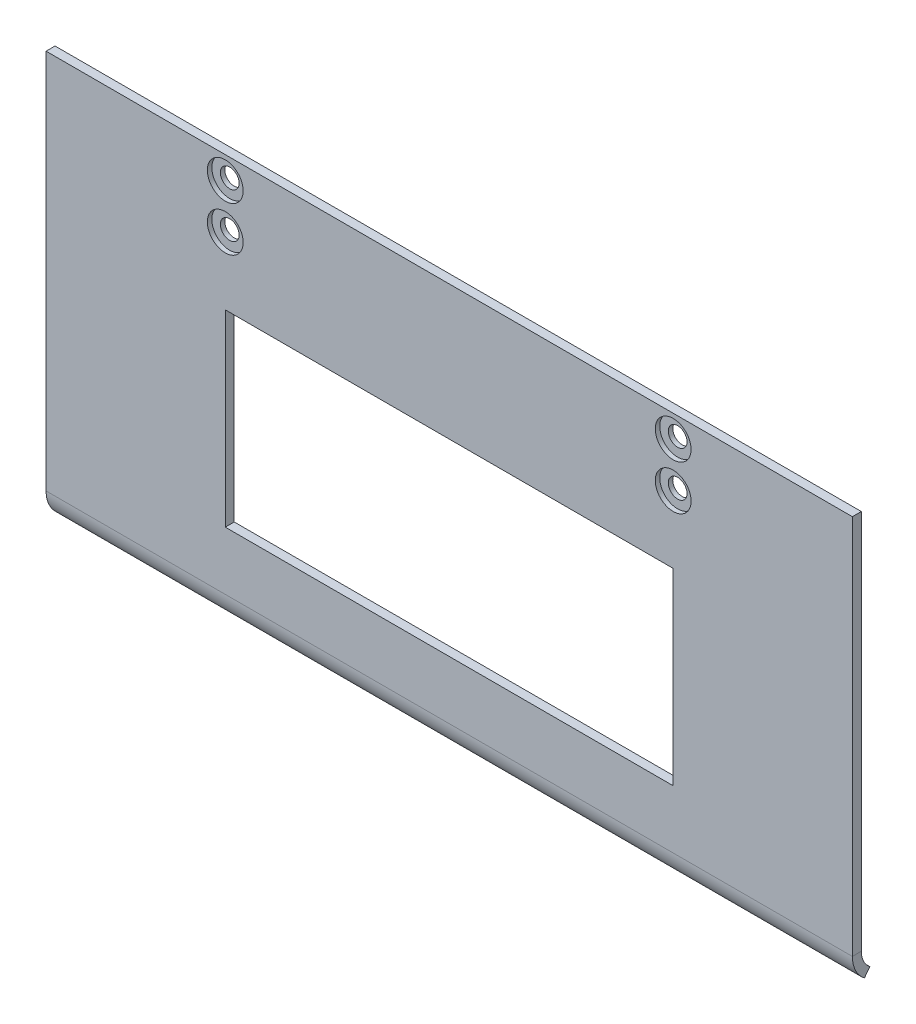
ISO-10303-21;
HEADER;
FILE_DESCRIPTION(('STEP AP214'),'2;1');
FILE_NAME('part.step','',(''),(''),'','','');
FILE_SCHEMA(('AUTOMOTIVE_DESIGN { 1 0 10303 214 1 1 1 1 }'));
ENDSEC;
DATA;
#1=APPLICATION_CONTEXT('core data for automotive mechanical design processes');
#2=APPLICATION_PROTOCOL_DEFINITION('international standard','automotive_design',2000,#1);
#3=PRODUCT_CONTEXT('',#1,'mechanical');
#4=PRODUCT('Part','Part','',(#3));
#5=PRODUCT_RELATED_PRODUCT_CATEGORY('part','',(#4));
#6=PRODUCT_DEFINITION_FORMATION('','',#4);
#7=PRODUCT_DEFINITION_CONTEXT('part definition',#1,'design');
#8=PRODUCT_DEFINITION('design','',#6,#7);
#9=PRODUCT_DEFINITION_SHAPE('','',#8);
#10=(LENGTH_UNIT() NAMED_UNIT(*) SI_UNIT(.MILLI.,.METRE.));
#11=(NAMED_UNIT(*) PLANE_ANGLE_UNIT() SI_UNIT($,.RADIAN.));
#12=(NAMED_UNIT(*) SI_UNIT($,.STERADIAN.) SOLID_ANGLE_UNIT());
#13=UNCERTAINTY_MEASURE_WITH_UNIT(LENGTH_MEASURE(1.E-05),#10,'distance_accuracy_value','');
#14=(GEOMETRIC_REPRESENTATION_CONTEXT(3) GLOBAL_UNCERTAINTY_ASSIGNED_CONTEXT((#13)) GLOBAL_UNIT_ASSIGNED_CONTEXT((#10,
#11,#12)) REPRESENTATION_CONTEXT('',''));
#15=CARTESIAN_POINT('',(0.,0.,0.));
#16=DIRECTION('',(0.,0.,1.));
#17=DIRECTION('',(1.,0.,0.));
#18=AXIS2_PLACEMENT_3D('',#15,#16,#17);
#19=CARTESIAN_POINT('',(-50.,30.,8.));
#20=DIRECTION('',(0.,0.,-1.));
#21=DIRECTION('',(-1.,0.,0.));
#22=AXIS2_PLACEMENT_3D('',#19,#20,#21);
#23=CYLINDRICAL_SURFACE('',#22,2.10000000000001);
#24=CARTESIAN_POINT('',(-50.,30.,-2.));
#25=DIRECTION('',(0.,0.,-1.));
#26=DIRECTION('',(-1.,0.,0.));
#27=AXIS2_PLACEMENT_3D('',#24,#25,#26);
#28=CIRCLE('',#27,2.10000000000001);
#29=CARTESIAN_POINT('',(-52.1,30.,-2.));
#30=VERTEX_POINT('',#29);
#31=EDGE_CURVE('E266',#30,#30,#28,.T.);
#32=ORIENTED_EDGE('',*,*,#31,.T.);
#33=EDGE_LOOP('',(#32));
#34=FACE_BOUND('',#33,.T.);
#35=CARTESIAN_POINT('',(-50.,30.,-1.));
#36=DIRECTION('',(0.,0.,1.));
#37=DIRECTION('',(1.,0.,0.));
#38=AXIS2_PLACEMENT_3D('',#35,#36,#37);
#39=CIRCLE('',#38,2.10000000000001);
#40=CARTESIAN_POINT('',(-47.9,30.,-1.));
#41=VERTEX_POINT('',#40);
#42=EDGE_CURVE('E66',#41,#41,#39,.F.);
#43=ORIENTED_EDGE('',*,*,#42,.F.);
#44=EDGE_LOOP('',(#43));
#45=FACE_BOUND('',#44,.T.);
#46=ADVANCED_FACE('F62',(#34,#45),#23,.F.);
#47=CARTESIAN_POINT('',(50.,40.0000000000003,8.));
#48=DIRECTION('',(0.,0.,-1.));
#49=DIRECTION('',(-1.,0.,0.));
#50=AXIS2_PLACEMENT_3D('',#47,#48,#49);
#51=CYLINDRICAL_SURFACE('',#50,2.09099110074925);
#52=CARTESIAN_POINT('',(50.,40.0000000000003,-2.));
#53=DIRECTION('',(0.,0.,-1.));
#54=DIRECTION('',(-1.,0.,0.));
#55=AXIS2_PLACEMENT_3D('',#52,#53,#54);
#56=CIRCLE('',#55,2.09099110074925);
#57=CARTESIAN_POINT('',(47.9090088992508,40.0000000000003,-2.));
#58=VERTEX_POINT('',#57);
#59=EDGE_CURVE('E250',#58,#58,#56,.T.);
#60=ORIENTED_EDGE('',*,*,#59,.T.);
#61=EDGE_LOOP('',(#60));
#62=FACE_BOUND('',#61,.T.);
#63=CARTESIAN_POINT('',(50.,40.0000000000003,-1.));
#64=DIRECTION('',(0.,0.,1.));
#65=DIRECTION('',(1.,0.,0.));
#66=AXIS2_PLACEMENT_3D('',#63,#64,#65);
#67=CIRCLE('',#66,2.09099110074925);
#68=CARTESIAN_POINT('',(52.0909911007493,40.0000000000003,-1.));
#69=VERTEX_POINT('',#68);
#70=EDGE_CURVE('E245',#69,#69,#67,.F.);
#71=ORIENTED_EDGE('',*,*,#70,.F.);
#72=EDGE_LOOP('',(#71));
#73=FACE_BOUND('',#72,.T.);
#74=ADVANCED_FACE('F380',(#62,#73),#51,.F.);
#75=CARTESIAN_POINT('',(50.,30.0000000000003,8.));
#76=DIRECTION('',(0.,0.,-1.));
#77=DIRECTION('',(-1.,0.,0.));
#78=AXIS2_PLACEMENT_3D('',#75,#76,#77);
#79=CYLINDRICAL_SURFACE('',#78,2.1);
#80=CARTESIAN_POINT('',(50.,30.0000000000003,-2.));
#81=DIRECTION('',(0.,0.,-1.));
#82=DIRECTION('',(-1.,0.,0.));
#83=AXIS2_PLACEMENT_3D('',#80,#81,#82);
#84=CIRCLE('',#83,2.1);
#85=CARTESIAN_POINT('',(47.9,30.0000000000003,-2.));
#86=VERTEX_POINT('',#85);
#87=EDGE_CURVE('E254',#86,#86,#84,.T.);
#88=ORIENTED_EDGE('',*,*,#87,.T.);
#89=EDGE_LOOP('',(#88));
#90=FACE_BOUND('',#89,.T.);
#91=CARTESIAN_POINT('',(50.,30.0000000000003,-1.));
#92=DIRECTION('',(0.,0.,1.));
#93=DIRECTION('',(1.,0.,0.));
#94=AXIS2_PLACEMENT_3D('',#91,#92,#93);
#95=CIRCLE('',#94,2.1);
#96=CARTESIAN_POINT('',(52.1,30.0000000000003,-1.));
#97=VERTEX_POINT('',#96);
#98=EDGE_CURVE('E242',#97,#97,#95,.F.);
#99=ORIENTED_EDGE('',*,*,#98,.F.);
#100=EDGE_LOOP('',(#99));
#101=FACE_BOUND('',#100,.T.);
#102=ADVANCED_FACE('F375',(#90,#101),#79,.F.);
#103=CARTESIAN_POINT('',(-50.,40.,8.));
#104=DIRECTION('',(0.,0.,-1.));
#105=DIRECTION('',(-1.,0.,0.));
#106=AXIS2_PLACEMENT_3D('',#103,#104,#105);
#107=CYLINDRICAL_SURFACE('',#106,2.10000000000001);
#108=CARTESIAN_POINT('',(-50.,40.,-2.));
#109=DIRECTION('',(0.,0.,-1.));
#110=DIRECTION('',(-1.,0.,0.));
#111=AXIS2_PLACEMENT_3D('',#108,#109,#110);
#112=CIRCLE('',#111,2.10000000000001);
#113=CARTESIAN_POINT('',(-52.1,40.,-2.));
#114=VERTEX_POINT('',#113);
#115=EDGE_CURVE('E259',#114,#114,#112,.T.);
#116=ORIENTED_EDGE('',*,*,#115,.T.);
#117=EDGE_LOOP('',(#116));
#118=FACE_BOUND('',#117,.T.);
#119=CARTESIAN_POINT('',(-50.,40.,-1.));
#120=DIRECTION('',(0.,0.,1.));
#121=DIRECTION('',(1.,0.,0.));
#122=AXIS2_PLACEMENT_3D('',#119,#120,#121);
#123=CIRCLE('',#122,2.10000000000001);
#124=CARTESIAN_POINT('',(-47.9,40.,-1.));
#125=VERTEX_POINT('',#124);
#126=EDGE_CURVE('E239',#125,#125,#123,.F.);
#127=ORIENTED_EDGE('',*,*,#126,.F.);
#128=EDGE_LOOP('',(#127));
#129=FACE_BOUND('',#128,.T.);
#130=ADVANCED_FACE('F365',(#118,#129),#107,.F.);
#131=CARTESIAN_POINT('',(-90.,45.,-2.));
#132=DIRECTION('',(-1.,0.,0.));
#133=DIRECTION('',(0.,0.,1.));
#134=AXIS2_PLACEMENT_3D('',#131,#132,#133);
#135=PLANE('',#134);
#136=DIRECTION('',(0.,-1.,0.));
#137=VECTOR('',#136,1.);
#138=CARTESIAN_POINT('',(-90.,45.,-2.));
#139=LINE('',#138,#137);
#140=CARTESIAN_POINT('',(-90.,45.,-2.));
#141=VERTEX_POINT('',#140);
#142=CARTESIAN_POINT('',(-90.,-40.0233006270256,-1.99999999999999));
#143=VERTEX_POINT('',#142);
#144=EDGE_CURVE('E215',#141,#143,#139,.T.);
#145=ORIENTED_EDGE('',*,*,#144,.T.);
#146=DIRECTION('',(0.,0.,1.));
#147=VECTOR('',#146,1.);
#148=CARTESIAN_POINT('',(-90.,-40.0233006270256,-1.99999999999999));
#149=LINE('',#148,#147);
#150=CARTESIAN_POINT('',(-90.,-40.0233006270256,0.));
#151=VERTEX_POINT('',#150);
#152=EDGE_CURVE('E192',#143,#151,#149,.T.);
#153=ORIENTED_EDGE('',*,*,#152,.T.);
#154=DIRECTION('',(0.,-1.,0.));
#155=VECTOR('',#154,1.);
#156=CARTESIAN_POINT('',(-90.,45.,0.));
#157=LINE('',#156,#155);
#158=CARTESIAN_POINT('',(-90.,45.,0.));
#159=VERTEX_POINT('',#158);
#160=EDGE_CURVE('E212',#159,#151,#157,.T.);
#161=ORIENTED_EDGE('',*,*,#160,.F.);
#162=DIRECTION('',(0.,0.,1.));
#163=VECTOR('',#162,1.);
#164=CARTESIAN_POINT('',(-90.,45.,-2.));
#165=LINE('',#164,#163);
#166=EDGE_CURVE('E225',#141,#159,#165,.T.);
#167=ORIENTED_EDGE('',*,*,#166,.F.);
#168=EDGE_LOOP('',(#145,#153,#161,#167));
#169=FACE_BOUND('',#168,.T.);
#170=ADVANCED_FACE('F363',(#169),#135,.T.);
#171=CARTESIAN_POINT('',(0.,0.,-2.));
#172=DIRECTION('',(0.,0.,1.));
#173=DIRECTION('',(1.,0.,0.));
#174=AXIS2_PLACEMENT_3D('',#171,#172,#173);
#175=PLANE('',#174);
#176=ORIENTED_EDGE('',*,*,#115,.F.);
#177=EDGE_LOOP('',(#176));
#178=FACE_BOUND('',#177,.T.);
#179=ORIENTED_EDGE('',*,*,#87,.F.);
#180=EDGE_LOOP('',(#179));
#181=FACE_BOUND('',#180,.T.);
#182=ORIENTED_EDGE('',*,*,#59,.F.);
#183=EDGE_LOOP('',(#182));
#184=FACE_BOUND('',#183,.T.);
#185=ORIENTED_EDGE('',*,*,#31,.F.);
#186=EDGE_LOOP('',(#185));
#187=FACE_BOUND('',#186,.T.);
#188=DIRECTION('',(0.,-1.,0.));
#189=VECTOR('',#188,1.);
#190=CARTESIAN_POINT('',(50.,-27.0233006270256,-2.));
#191=LINE('',#190,#189);
#192=CARTESIAN_POINT('',(50.,15.,-2.));
#193=VERTEX_POINT('',#192);
#194=CARTESIAN_POINT('',(50.,-27.0233006270256,-2.));
#195=VERTEX_POINT('',#194);
#196=EDGE_CURVE('E310',#193,#195,#191,.T.);
#197=ORIENTED_EDGE('',*,*,#196,.F.);
#198=DIRECTION('',(1.,0.,0.));
#199=VECTOR('',#198,1.);
#200=CARTESIAN_POINT('',(-50.,15.,-2.));
#201=LINE('',#200,#199);
#202=CARTESIAN_POINT('',(-50.,15.,-2.));
#203=VERTEX_POINT('',#202);
#204=EDGE_CURVE('E288',#203,#193,#201,.T.);
#205=ORIENTED_EDGE('',*,*,#204,.F.);
#206=DIRECTION('',(0.,1.,0.));
#207=VECTOR('',#206,1.);
#208=CARTESIAN_POINT('',(-50.,-27.0233006270256,-2.));
#209=LINE('',#208,#207);
#210=CARTESIAN_POINT('',(-50.,-27.0233006270256,-2.));
#211=VERTEX_POINT('',#210);
#212=EDGE_CURVE('E316',#211,#203,#209,.T.);
#213=ORIENTED_EDGE('',*,*,#212,.F.);
#214=DIRECTION('',(-1.,0.,0.));
#215=VECTOR('',#214,1.);
#216=CARTESIAN_POINT('',(-50.,-27.0233006270256,-2.));
#217=LINE('',#216,#215);
#218=EDGE_CURVE('E313',#195,#211,#217,.T.);
#219=ORIENTED_EDGE('',*,*,#218,.F.);
#220=EDGE_LOOP('',(#197,#205,#213,#219));
#221=FACE_BOUND('',#220,.T.);
#222=DIRECTION('',(-1.,0.,0.));
#223=VECTOR('',#222,1.);
#224=CARTESIAN_POINT('',(-90.,-40.0233006270256,-1.99999999999999));
#225=LINE('',#224,#223);
#226=CARTESIAN_POINT('',(90.,-40.0233006270256,-1.99999999999999));
#227=VERTEX_POINT('',#226);
#228=EDGE_CURVE('E193',#143,#227,#225,.F.);
#229=ORIENTED_EDGE('',*,*,#228,.F.);
#230=ORIENTED_EDGE('',*,*,#144,.F.);
#231=DIRECTION('',(-1.,0.,0.));
#232=VECTOR('',#231,1.);
#233=CARTESIAN_POINT('',(-90.,45.,-2.));
#234=LINE('',#233,#232);
#235=CARTESIAN_POINT('',(90.,45.,-2.));
#236=VERTEX_POINT('',#235);
#237=EDGE_CURVE('E211',#236,#141,#234,.T.);
#238=ORIENTED_EDGE('',*,*,#237,.F.);
#239=DIRECTION('',(0.,1.,0.));
#240=VECTOR('',#239,1.);
#241=CARTESIAN_POINT('',(90.,45.,-2.));
#242=LINE('',#241,#240);
#243=EDGE_CURVE('E209',#227,#236,#242,.T.);
#244=ORIENTED_EDGE('',*,*,#243,.F.);
#245=EDGE_LOOP('',(#229,#230,#238,#244));
#246=FACE_BOUND('',#245,.T.);
#247=ADVANCED_FACE('F352',(#178,#181,#184,#187,#221,#246),#175,.F.);
#248=CARTESIAN_POINT('',(0.,0.,0.));
#249=DIRECTION('',(0.,0.,1.));
#250=DIRECTION('',(1.,0.,0.));
#251=AXIS2_PLACEMENT_3D('',#248,#249,#250);
#252=PLANE('',#251);
#253=CARTESIAN_POINT('',(-50.,30.,0.));
#254=DIRECTION('',(0.,0.,1.));
#255=DIRECTION('',(1.,0.,0.));
#256=AXIS2_PLACEMENT_3D('',#253,#254,#255);
#257=CIRCLE('',#256,4.00000000000001);
#258=CARTESIAN_POINT('',(-46.,30.,0.));
#259=VERTEX_POINT('',#258);
#260=EDGE_CURVE('E462',#259,#259,#257,.T.);
#261=ORIENTED_EDGE('',*,*,#260,.F.);
#262=EDGE_LOOP('',(#261));
#263=FACE_BOUND('',#262,.T.);
#264=CARTESIAN_POINT('',(50.,40.0000000000003,0.));
#265=DIRECTION('',(0.,0.,1.));
#266=DIRECTION('',(1.,0.,0.));
#267=AXIS2_PLACEMENT_3D('',#264,#265,#266);
#268=CIRCLE('',#267,4.);
#269=CARTESIAN_POINT('',(54.,40.0000000000003,0.));
#270=VERTEX_POINT('',#269);
#271=EDGE_CURVE('E466',#270,#270,#268,.T.);
#272=ORIENTED_EDGE('',*,*,#271,.F.);
#273=EDGE_LOOP('',(#272));
#274=FACE_BOUND('',#273,.T.);
#275=CARTESIAN_POINT('',(50.,30.0000000000003,0.));
#276=DIRECTION('',(0.,0.,1.));
#277=DIRECTION('',(1.,0.,0.));
#278=AXIS2_PLACEMENT_3D('',#275,#276,#277);
#279=CIRCLE('',#278,4.00000000000001);
#280=CARTESIAN_POINT('',(54.,30.0000000000003,0.));
#281=VERTEX_POINT('',#280);
#282=EDGE_CURVE('E470',#281,#281,#279,.T.);
#283=ORIENTED_EDGE('',*,*,#282,.F.);
#284=EDGE_LOOP('',(#283));
#285=FACE_BOUND('',#284,.T.);
#286=CARTESIAN_POINT('',(-50.,40.,0.));
#287=DIRECTION('',(0.,0.,1.));
#288=DIRECTION('',(1.,0.,0.));
#289=AXIS2_PLACEMENT_3D('',#286,#287,#288);
#290=CIRCLE('',#289,4.00000000000001);
#291=CARTESIAN_POINT('',(-46.,40.,0.));
#292=VERTEX_POINT('',#291);
#293=EDGE_CURVE('E263',#292,#292,#290,.T.);
#294=ORIENTED_EDGE('',*,*,#293,.F.);
#295=EDGE_LOOP('',(#294));
#296=FACE_BOUND('',#295,.T.);
#297=DIRECTION('',(-1.,0.,0.));
#298=VECTOR('',#297,1.);
#299=CARTESIAN_POINT('',(0.,15.,0.));
#300=LINE('',#299,#298);
#301=CARTESIAN_POINT('',(50.,15.,0.));
#302=VERTEX_POINT('',#301);
#303=CARTESIAN_POINT('',(-50.,15.,0.));
#304=VERTEX_POINT('',#303);
#305=EDGE_CURVE('E236',#302,#304,#300,.T.);
#306=ORIENTED_EDGE('',*,*,#305,.F.);
#307=DIRECTION('',(0.,1.,0.));
#308=VECTOR('',#307,1.);
#309=CARTESIAN_POINT('',(50.,0.,0.));
#310=LINE('',#309,#308);
#311=CARTESIAN_POINT('',(50.,-27.0233006270256,0.));
#312=VERTEX_POINT('',#311);
#313=EDGE_CURVE('E227',#312,#302,#310,.T.);
#314=ORIENTED_EDGE('',*,*,#313,.F.);
#315=DIRECTION('',(1.,0.,0.));
#316=VECTOR('',#315,1.);
#317=CARTESIAN_POINT('',(0.,-27.0233006270256,0.));
#318=LINE('',#317,#316);
#319=CARTESIAN_POINT('',(-50.,-27.0233006270256,0.));
#320=VERTEX_POINT('',#319);
#321=EDGE_CURVE('E231',#320,#312,#318,.T.);
#322=ORIENTED_EDGE('',*,*,#321,.F.);
#323=DIRECTION('',(0.,-1.,0.));
#324=VECTOR('',#323,1.);
#325=CARTESIAN_POINT('',(-50.,0.,0.));
#326=LINE('',#325,#324);
#327=EDGE_CURVE('E234',#304,#320,#326,.T.);
#328=ORIENTED_EDGE('',*,*,#327,.F.);
#329=EDGE_LOOP('',(#306,#314,#322,#328));
#330=FACE_BOUND('',#329,.T.);
#331=ORIENTED_EDGE('',*,*,#160,.T.);
#332=DIRECTION('',(-1.,0.,0.));
#333=VECTOR('',#332,1.);
#334=CARTESIAN_POINT('',(-90.,-40.0233006270256,0.));
#335=LINE('',#334,#333);
#336=CARTESIAN_POINT('',(90.,-40.0233006270255,0.));
#337=VERTEX_POINT('',#336);
#338=EDGE_CURVE('E334',#151,#337,#335,.F.);
#339=ORIENTED_EDGE('',*,*,#338,.T.);
#340=DIRECTION('',(0.,1.,0.));
#341=VECTOR('',#340,1.);
#342=CARTESIAN_POINT('',(90.,45.,0.));
#343=LINE('',#342,#341);
#344=CARTESIAN_POINT('',(90.,45.,0.));
#345=VERTEX_POINT('',#344);
#346=EDGE_CURVE('E206',#337,#345,#343,.T.);
#347=ORIENTED_EDGE('',*,*,#346,.T.);
#348=DIRECTION('',(-1.,0.,0.));
#349=VECTOR('',#348,1.);
#350=CARTESIAN_POINT('',(-90.,45.,0.));
#351=LINE('',#350,#349);
#352=EDGE_CURVE('E220',#345,#159,#351,.T.);
#353=ORIENTED_EDGE('',*,*,#352,.T.);
#354=EDGE_LOOP('',(#331,#339,#347,#353));
#355=FACE_BOUND('',#354,.T.);
#356=ADVANCED_FACE('F359',(#263,#274,#285,#296,#330,#355),#252,.T.);
#357=CARTESIAN_POINT('',(90.,45.,-2.));
#358=DIRECTION('',(1.,0.,0.));
#359=DIRECTION('',(0.,0.,-1.));
#360=AXIS2_PLACEMENT_3D('',#357,#358,#359);
#361=PLANE('',#360);
#362=DIRECTION('',(0.,0.,1.));
#363=VECTOR('',#362,1.);
#364=CARTESIAN_POINT('',(90.,-40.0233006270256,-1.99999999999999));
#365=LINE('',#364,#363);
#366=EDGE_CURVE('E203',#227,#337,#365,.T.);
#367=ORIENTED_EDGE('',*,*,#366,.F.);
#368=ORIENTED_EDGE('',*,*,#243,.T.);
#369=DIRECTION('',(0.,0.,1.));
#370=VECTOR('',#369,1.);
#371=CARTESIAN_POINT('',(90.,45.,-2.));
#372=LINE('',#371,#370);
#373=EDGE_CURVE('E218',#236,#345,#372,.T.);
#374=ORIENTED_EDGE('',*,*,#373,.T.);
#375=ORIENTED_EDGE('',*,*,#346,.F.);
#376=EDGE_LOOP('',(#367,#368,#374,#375));
#377=FACE_BOUND('',#376,.T.);
#378=ADVANCED_FACE('F64',(#377),#361,.T.);
#379=CARTESIAN_POINT('',(-90.,45.,-2.));
#380=DIRECTION('',(0.,1.,0.));
#381=DIRECTION('',(0.,0.,1.));
#382=AXIS2_PLACEMENT_3D('',#379,#380,#381);
#383=PLANE('',#382);
#384=ORIENTED_EDGE('',*,*,#352,.F.);
#385=ORIENTED_EDGE('',*,*,#373,.F.);
#386=ORIENTED_EDGE('',*,*,#237,.T.);
#387=ORIENTED_EDGE('',*,*,#166,.T.);
#388=EDGE_LOOP('',(#384,#385,#386,#387));
#389=FACE_BOUND('',#388,.T.);
#390=ADVANCED_FACE('F356',(#389),#383,.T.);
#391=CARTESIAN_POINT('',(90.,-40.0233006270256,-6.99999999999999));
#392=DIRECTION('',(1.,0.,0.));
#393=DIRECTION('',(0.,0.,-1.));
#394=AXIS2_PLACEMENT_3D('',#391,#392,#393);
#395=PLANE('',#394);
#396=DIRECTION('',(0.,0.788010753606719,-0.615661475325662));
#397=VECTOR('',#396,1.);
#398=CARTESIAN_POINT('',(90.,-45.5393759022726,-2.69036967272036));
#399=LINE('',#398,#397);
#400=CARTESIAN_POINT('',(90.,-43.9633543950592,-3.92169262337168));
#401=VERTEX_POINT('',#400);
#402=CARTESIAN_POINT('',(90.,-45.5393759022726,-2.69036967272036));
#403=VERTEX_POINT('',#402);
#404=EDGE_CURVE('E322',#401,#403,#399,.F.);
#405=ORIENTED_EDGE('',*,*,#404,.F.);
#406=CARTESIAN_POINT('',(90.,-40.0233006270256,-6.99999999999999));
#407=DIRECTION('',(-1.,0.,0.));
#408=DIRECTION('',(0.,0.,1.));
#409=AXIS2_PLACEMENT_3D('',#406,#407,#408);
#410=CIRCLE('',#409,5.00000000000001);
#411=EDGE_CURVE('E196',#227,#401,#410,.F.);
#412=ORIENTED_EDGE('',*,*,#411,.F.);
#413=ORIENTED_EDGE('',*,*,#366,.T.);
#414=CARTESIAN_POINT('',(90.,-40.0233006270256,-6.99999999999999));
#415=DIRECTION('',(-1.,0.,0.));
#416=DIRECTION('',(0.,0.,1.));
#417=AXIS2_PLACEMENT_3D('',#414,#415,#416);
#418=CIRCLE('',#417,7.00000000000001);
#419=EDGE_CURVE('E208',#337,#403,#418,.F.);
#420=ORIENTED_EDGE('',*,*,#419,.T.);
#421=EDGE_LOOP('',(#405,#412,#413,#420));
#422=FACE_BOUND('',#421,.T.);
#423=ADVANCED_FACE('F345',(#422),#395,.T.);
#424=CARTESIAN_POINT('',(-90.,-40.0233006270256,-6.99999999999999));
#425=DIRECTION('',(1.,0.,0.));
#426=DIRECTION('',(0.,0.,-1.));
#427=AXIS2_PLACEMENT_3D('',#424,#425,#426);
#428=PLANE('',#427);
#429=CARTESIAN_POINT('',(-90.,-40.0233006270256,-6.99999999999999));
#430=DIRECTION('',(-1.,0.,0.));
#431=DIRECTION('',(0.,0.,1.));
#432=AXIS2_PLACEMENT_3D('',#429,#430,#431);
#433=CIRCLE('',#432,5.00000000000001);
#434=CARTESIAN_POINT('',(-90.,-43.9633543950592,-3.92169262337168));
#435=VERTEX_POINT('',#434);
#436=EDGE_CURVE('E183',#435,#143,#433,.T.);
#437=ORIENTED_EDGE('',*,*,#436,.F.);
#438=DIRECTION('',(0.,0.788010753606719,-0.615661475325662));
#439=VECTOR('',#438,1.);
#440=CARTESIAN_POINT('',(-90.,-43.9633543950592,-3.92169262337168));
#441=LINE('',#440,#439);
#442=CARTESIAN_POINT('',(-90.,-45.5393759022726,-2.69036967272036));
#443=VERTEX_POINT('',#442);
#444=EDGE_CURVE('E165',#435,#443,#441,.F.);
#445=ORIENTED_EDGE('',*,*,#444,.T.);
#446=CARTESIAN_POINT('',(-90.,-40.0233006270256,-6.99999999999999));
#447=DIRECTION('',(-1.,0.,0.));
#448=DIRECTION('',(0.,0.,1.));
#449=AXIS2_PLACEMENT_3D('',#446,#447,#448);
#450=CIRCLE('',#449,7.00000000000001);
#451=EDGE_CURVE('E337',#443,#151,#450,.T.);
#452=ORIENTED_EDGE('',*,*,#451,.T.);
#453=ORIENTED_EDGE('',*,*,#152,.F.);
#454=EDGE_LOOP('',(#437,#445,#452,#453));
#455=FACE_BOUND('',#454,.T.);
#456=ADVANCED_FACE('F190',(#455),#428,.F.);
#457=CARTESIAN_POINT('',(-90.,-40.0233006270256,-6.99999999999999));
#458=DIRECTION('',(-1.,0.,0.));
#459=DIRECTION('',(0.,-0.788010753606719,0.615661475325662));
#460=AXIS2_PLACEMENT_3D('',#457,#458,#459);
#461=CYLINDRICAL_SURFACE('',#460,7.00000000000001);
#462=ORIENTED_EDGE('',*,*,#338,.F.);
#463=ORIENTED_EDGE('',*,*,#451,.F.);
#464=DIRECTION('',(-1.,0.,0.));
#465=VECTOR('',#464,1.);
#466=CARTESIAN_POINT('',(90.,-45.5393759022726,-2.69036967272036));
#467=LINE('',#466,#465);
#468=CARTESIAN_POINT('',(-65.,-45.5393759022726,-2.69036967272036));
#469=VERTEX_POINT('',#468);
#470=EDGE_CURVE('E171',#443,#469,#467,.F.);
#471=ORIENTED_EDGE('',*,*,#470,.T.);
#472=CARTESIAN_POINT('',(65.,-45.5393759022726,-2.69036967272036));
#473=VERTEX_POINT('',#472);
#474=EDGE_CURVE('E176',#469,#473,#467,.F.);
#475=ORIENTED_EDGE('',*,*,#474,.T.);
#476=DIRECTION('',(1.,0.,0.));
#477=VECTOR('',#476,1.);
#478=CARTESIAN_POINT('',(0.,-45.5393759022726,-2.69036967272036));
#479=LINE('',#478,#477);
#480=EDGE_CURVE('E281',#473,#403,#479,.T.);
#481=ORIENTED_EDGE('',*,*,#480,.T.);
#482=ORIENTED_EDGE('',*,*,#419,.F.);
#483=EDGE_LOOP('',(#462,#463,#471,#475,#481,#482));
#484=FACE_BOUND('',#483,.T.);
#485=ADVANCED_FACE('F361',(#484),#461,.T.);
#486=CARTESIAN_POINT('',(-90.,-40.0233006270256,-6.99999999999999));
#487=DIRECTION('',(-1.,0.,0.));
#488=DIRECTION('',(0.,-0.788010753606719,0.615661475325662));
#489=AXIS2_PLACEMENT_3D('',#486,#487,#488);
#490=CYLINDRICAL_SURFACE('',#489,5.00000000000001);
#491=ORIENTED_EDGE('',*,*,#228,.T.);
#492=ORIENTED_EDGE('',*,*,#411,.T.);
#493=DIRECTION('',(-1.,0.,0.));
#494=VECTOR('',#493,1.);
#495=CARTESIAN_POINT('',(90.,-43.9633543950592,-3.92169262337168));
#496=LINE('',#495,#494);
#497=CARTESIAN_POINT('',(65.,-43.9633543950592,-3.92169262337168));
#498=VERTEX_POINT('',#497);
#499=EDGE_CURVE('E177',#401,#498,#496,.T.);
#500=ORIENTED_EDGE('',*,*,#499,.T.);
#501=CARTESIAN_POINT('',(-65.,-43.9633543950592,-3.92169262337168));
#502=VERTEX_POINT('',#501);
#503=EDGE_CURVE('E187',#498,#502,#496,.T.);
#504=ORIENTED_EDGE('',*,*,#503,.T.);
#505=DIRECTION('',(1.,0.,0.));
#506=VECTOR('',#505,1.);
#507=CARTESIAN_POINT('',(-90.,-43.9633543950592,-3.92169262337168));
#508=LINE('',#507,#506);
#509=EDGE_CURVE('E169',#435,#502,#508,.T.);
#510=ORIENTED_EDGE('',*,*,#509,.F.);
#511=ORIENTED_EDGE('',*,*,#436,.T.);
#512=EDGE_LOOP('',(#491,#492,#500,#504,#510,#511));
#513=FACE_BOUND('',#512,.T.);
#514=ADVANCED_FACE('F182',(#513),#490,.F.);
#515=CARTESIAN_POINT('',(0.,-26.0109320017846,22.304898687461));
#516=DIRECTION('',(0.,0.788010753606719,-0.615661475325662));
#517=DIRECTION('',(0.,0.615661475325662,0.788010753606719));
#518=AXIS2_PLACEMENT_3D('',#515,#516,#517);
#519=PLANE('',#518);
#520=CARTESIAN_POINT('',(60.,-53.9036738275228,-13.3961828113142));
#521=DIRECTION('',(0.,-0.788010753606719,0.615661475325662));
#522=DIRECTION('',(0.,-0.615661475325662,-0.788010753606719));
#523=AXIS2_PLACEMENT_3D('',#520,#521,#522);
#524=CIRCLE('',#523,2.1);
#525=CARTESIAN_POINT('',(60.,-55.1965629257067,-15.0510053938883));
#526=VERTEX_POINT('',#525);
#527=EDGE_CURVE('E289',#526,#526,#524,.T.);
#528=ORIENTED_EDGE('',*,*,#527,.F.);
#529=EDGE_LOOP('',(#528));
#530=FACE_BOUND('',#529,.T.);
#531=CARTESIAN_POINT('',(20.,-53.9036738275228,-13.3961828113142));
#532=DIRECTION('',(0.,-0.788010753606719,0.615661475325662));
#533=DIRECTION('',(0.,-0.615661475325662,-0.788010753606719));
#534=AXIS2_PLACEMENT_3D('',#531,#532,#533);
#535=CIRCLE('',#534,2.1);
#536=CARTESIAN_POINT('',(20.,-55.1965629257067,-15.0510053938883));
#537=VERTEX_POINT('',#536);
#538=EDGE_CURVE('E292',#537,#537,#535,.T.);
#539=ORIENTED_EDGE('',*,*,#538,.F.);
#540=EDGE_LOOP('',(#539));
#541=FACE_BOUND('',#540,.T.);
#542=CARTESIAN_POINT('',(-20.,-53.9036738275228,-13.3961828113142));
#543=DIRECTION('',(0.,-0.788010753606719,0.615661475325662));
#544=DIRECTION('',(0.,0.615661475325662,0.788010753606719));
#545=AXIS2_PLACEMENT_3D('',#542,#543,#544);
#546=CIRCLE('',#545,2.09999999999999);
#547=CARTESIAN_POINT('',(-20.,-52.6107847293389,-11.7413602287401));
#548=VERTEX_POINT('',#547);
#549=EDGE_CURVE('E298',#548,#548,#546,.T.);
#550=ORIENTED_EDGE('',*,*,#549,.F.);
#551=EDGE_LOOP('',(#550));
#552=FACE_BOUND('',#551,.T.);
#553=CARTESIAN_POINT('',(-60.,-53.9036738275228,-13.3961828113142));
#554=DIRECTION('',(0.,-0.788010753606719,0.615661475325662));
#555=DIRECTION('',(0.,0.615661475325662,0.788010753606719));
#556=AXIS2_PLACEMENT_3D('',#553,#554,#555);
#557=CIRCLE('',#556,2.10000000000001);
#558=CARTESIAN_POINT('',(-60.,-52.6107847293389,-11.7413602287401));
#559=VERTEX_POINT('',#558);
#560=EDGE_CURVE('E304',#559,#559,#557,.T.);
#561=ORIENTED_EDGE('',*,*,#560,.F.);
#562=EDGE_LOOP('',(#561));
#563=FACE_BOUND('',#562,.T.);
#564=ORIENTED_EDGE('',*,*,#474,.F.);
#565=DIRECTION('',(0.,-0.615661475325662,-0.788010753606719));
#566=VECTOR('',#565,1.);
#567=CARTESIAN_POINT('',(-65.,-26.0109320017846,22.304898687461));
#568=LINE('',#567,#566);
#569=CARTESIAN_POINT('',(-65.,-61.9072730067564,-23.6403226082015));
#570=VERTEX_POINT('',#569);
#571=EDGE_CURVE('E278',#469,#570,#568,.T.);
#572=ORIENTED_EDGE('',*,*,#571,.T.);
#573=DIRECTION('',(1.,0.,0.));
#574=VECTOR('',#573,1.);
#575=CARTESIAN_POINT('',(0.,-61.9072730067564,-23.6403226082016));
#576=LINE('',#575,#574);
#577=CARTESIAN_POINT('',(65.,-61.9072730067564,-23.6403226082016));
#578=VERTEX_POINT('',#577);
#579=EDGE_CURVE('E194',#570,#578,#576,.T.);
#580=ORIENTED_EDGE('',*,*,#579,.T.);
#581=DIRECTION('',(0.,0.615661475325662,0.788010753606719));
#582=VECTOR('',#581,1.);
#583=CARTESIAN_POINT('',(65.,-26.0109320017846,22.304898687461));
#584=LINE('',#583,#582);
#585=EDGE_CURVE('E79',#578,#473,#584,.T.);
#586=ORIENTED_EDGE('',*,*,#585,.T.);
#587=EDGE_LOOP('',(#564,#572,#580,#586));
#588=FACE_BOUND('',#587,.T.);
#589=ADVANCED_FACE('F436',(#530,#541,#552,#563,#588),#519,.F.);
#590=CARTESIAN_POINT('',(0.,-24.4349104945712,21.0735757368096));
#591=DIRECTION('',(0.,0.788010753606719,-0.615661475325662));
#592=DIRECTION('',(0.,0.615661475325662,0.788010753606719));
#593=AXIS2_PLACEMENT_3D('',#590,#591,#592);
#594=PLANE('',#593);
#595=DIRECTION('',(0.,-0.615661475325662,-0.788010753606719));
#596=VECTOR('',#595,1.);
#597=CARTESIAN_POINT('',(-65.,-60.331251499543,-24.8716455588529));
#598=LINE('',#597,#596);
#599=CARTESIAN_POINT('',(-65.,-60.331251499543,-24.8716455588529));
#600=VERTEX_POINT('',#599);
#601=EDGE_CURVE('E87',#502,#600,#598,.T.);
#602=ORIENTED_EDGE('',*,*,#601,.F.);
#603=ORIENTED_EDGE('',*,*,#503,.F.);
#604=DIRECTION('',(0.,0.615661475325662,0.788010753606719));
#605=VECTOR('',#604,1.);
#606=CARTESIAN_POINT('',(65.,-60.331251499543,-24.8716455588529));
#607=LINE('',#606,#605);
#608=CARTESIAN_POINT('',(65.,-60.331251499543,-24.8716455588529));
#609=VERTEX_POINT('',#608);
#610=EDGE_CURVE('E188',#609,#498,#607,.T.);
#611=ORIENTED_EDGE('',*,*,#610,.F.);
#612=DIRECTION('',(-1.,0.,0.));
#613=VECTOR('',#612,1.);
#614=CARTESIAN_POINT('',(90.,-60.331251499543,-24.8716455588529));
#615=LINE('',#614,#613);
#616=EDGE_CURVE('E199',#600,#609,#615,.F.);
#617=ORIENTED_EDGE('',*,*,#616,.F.);
#618=EDGE_LOOP('',(#602,#603,#611,#617));
#619=FACE_BOUND('',#618,.T.);
#620=CARTESIAN_POINT('',(60.,-52.3276523203094,-14.6275057619655));
#621=DIRECTION('',(0.,-0.788010753606719,0.615661475325662));
#622=DIRECTION('',(0.,-0.615661475325662,-0.788010753606719));
#623=AXIS2_PLACEMENT_3D('',#620,#621,#622);
#624=CIRCLE('',#623,2.1);
#625=CARTESIAN_POINT('',(60.,-53.6205414184933,-16.2823283445396));
#626=VERTEX_POINT('',#625);
#627=EDGE_CURVE('E285',#626,#626,#624,.T.);
#628=ORIENTED_EDGE('',*,*,#627,.T.);
#629=EDGE_LOOP('',(#628));
#630=FACE_BOUND('',#629,.T.);
#631=CARTESIAN_POINT('',(20.,-52.3276523203094,-14.6275057619655));
#632=DIRECTION('',(0.,-0.788010753606719,0.615661475325662));
#633=DIRECTION('',(0.,-0.615661475325662,-0.788010753606719));
#634=AXIS2_PLACEMENT_3D('',#631,#632,#633);
#635=CIRCLE('',#634,2.1);
#636=CARTESIAN_POINT('',(20.,-53.6205414184933,-16.2823283445396));
#637=VERTEX_POINT('',#636);
#638=EDGE_CURVE('E295',#637,#637,#635,.T.);
#639=ORIENTED_EDGE('',*,*,#638,.T.);
#640=EDGE_LOOP('',(#639));
#641=FACE_BOUND('',#640,.T.);
#642=CARTESIAN_POINT('',(-20.,-52.3276523203094,-14.6275057619655));
#643=DIRECTION('',(0.,-0.788010753606719,0.615661475325662));
#644=DIRECTION('',(0.,0.615661475325662,0.788010753606719));
#645=AXIS2_PLACEMENT_3D('',#642,#643,#644);
#646=CIRCLE('',#645,2.09999999999999);
#647=CARTESIAN_POINT('',(-20.,-51.0347632221255,-12.9726831793914));
#648=VERTEX_POINT('',#647);
#649=EDGE_CURVE('E301',#648,#648,#646,.T.);
#650=ORIENTED_EDGE('',*,*,#649,.T.);
#651=EDGE_LOOP('',(#650));
#652=FACE_BOUND('',#651,.T.);
#653=CARTESIAN_POINT('',(-60.,-52.3276523203094,-14.6275057619655));
#654=DIRECTION('',(0.,-0.788010753606719,0.615661475325662));
#655=DIRECTION('',(0.,0.615661475325662,0.788010753606719));
#656=AXIS2_PLACEMENT_3D('',#653,#654,#655);
#657=CIRCLE('',#656,2.10000000000001);
#658=CARTESIAN_POINT('',(-60.,-51.0347632221255,-12.9726831793914));
#659=VERTEX_POINT('',#658);
#660=EDGE_CURVE('E284',#659,#659,#657,.T.);
#661=ORIENTED_EDGE('',*,*,#660,.T.);
#662=EDGE_LOOP('',(#661));
#663=FACE_BOUND('',#662,.T.);
#664=ADVANCED_FACE('F439',(#619,#630,#641,#652,#663),#594,.T.);
#665=CARTESIAN_POINT('',(90.,-61.9072730067564,-23.6403226082016));
#666=DIRECTION('',(0.,0.615661475325662,0.788010753606719));
#667=DIRECTION('',(0.,-0.788010753606719,0.615661475325662));
#668=AXIS2_PLACEMENT_3D('',#665,#666,#667);
#669=PLANE('',#668);
#670=ORIENTED_EDGE('',*,*,#579,.F.);
#671=DIRECTION('',(0.,0.788010753606719,-0.615661475325662));
#672=VECTOR('',#671,1.);
#673=CARTESIAN_POINT('',(-65.,-61.9072730067564,-23.6403226082016));
#674=LINE('',#673,#672);
#675=EDGE_CURVE('E13',#570,#600,#674,.T.);
#676=ORIENTED_EDGE('',*,*,#675,.T.);
#677=ORIENTED_EDGE('',*,*,#616,.T.);
#678=DIRECTION('',(0.,-0.788010753606719,0.615661475325662));
#679=VECTOR('',#678,1.);
#680=CARTESIAN_POINT('',(65.,-61.9072730067564,-23.6403226082016));
#681=LINE('',#680,#679);
#682=EDGE_CURVE('E71',#609,#578,#681,.T.);
#683=ORIENTED_EDGE('',*,*,#682,.T.);
#684=EDGE_LOOP('',(#670,#676,#677,#683));
#685=FACE_BOUND('',#684,.T.);
#686=ADVANCED_FACE('F434',(#685),#669,.F.);
#687=CARTESIAN_POINT('',(-50.,15.,8.));
#688=DIRECTION('',(0.,1.,0.));
#689=DIRECTION('',(0.,0.,1.));
#690=AXIS2_PLACEMENT_3D('',#687,#688,#689);
#691=PLANE('',#690);
#692=ORIENTED_EDGE('',*,*,#305,.T.);
#693=DIRECTION('',(0.,0.,-1.));
#694=VECTOR('',#693,1.);
#695=CARTESIAN_POINT('',(-50.,15.,8.));
#696=LINE('',#695,#694);
#697=EDGE_CURVE('E320',#304,#203,#696,.T.);
#698=ORIENTED_EDGE('',*,*,#697,.T.);
#699=ORIENTED_EDGE('',*,*,#204,.T.);
#700=DIRECTION('',(0.,0.,-1.));
#701=VECTOR('',#700,1.);
#702=CARTESIAN_POINT('',(50.,15.,8.));
#703=LINE('',#702,#701);
#704=EDGE_CURVE('E319',#302,#193,#703,.T.);
#705=ORIENTED_EDGE('',*,*,#704,.F.);
#706=EDGE_LOOP('',(#692,#698,#699,#705));
#707=FACE_BOUND('',#706,.T.);
#708=ADVANCED_FACE('F424',(#707),#691,.F.);
#709=CARTESIAN_POINT('',(-50.,-27.0233006270256,8.));
#710=DIRECTION('',(-1.,0.,0.));
#711=DIRECTION('',(0.,0.,1.));
#712=AXIS2_PLACEMENT_3D('',#709,#710,#711);
#713=PLANE('',#712);
#714=ORIENTED_EDGE('',*,*,#327,.T.);
#715=DIRECTION('',(0.,0.,-1.));
#716=VECTOR('',#715,1.);
#717=CARTESIAN_POINT('',(-50.,-27.0233006270256,8.));
#718=LINE('',#717,#716);
#719=EDGE_CURVE('E323',#320,#211,#718,.T.);
#720=ORIENTED_EDGE('',*,*,#719,.T.);
#721=ORIENTED_EDGE('',*,*,#212,.T.);
#722=ORIENTED_EDGE('',*,*,#697,.F.);
#723=EDGE_LOOP('',(#714,#720,#721,#722));
#724=FACE_BOUND('',#723,.T.);
#725=ADVANCED_FACE('F420',(#724),#713,.F.);
#726=CARTESIAN_POINT('',(-50.,-27.0233006270256,8.));
#727=DIRECTION('',(0.,-1.,0.));
#728=DIRECTION('',(0.,0.,-1.));
#729=AXIS2_PLACEMENT_3D('',#726,#727,#728);
#730=PLANE('',#729);
#731=ORIENTED_EDGE('',*,*,#321,.T.);
#732=DIRECTION('',(0.,0.,-1.));
#733=VECTOR('',#732,1.);
#734=CARTESIAN_POINT('',(50.,-27.0233006270256,8.));
#735=LINE('',#734,#733);
#736=EDGE_CURVE('E325',#312,#195,#735,.T.);
#737=ORIENTED_EDGE('',*,*,#736,.T.);
#738=ORIENTED_EDGE('',*,*,#218,.T.);
#739=ORIENTED_EDGE('',*,*,#719,.F.);
#740=EDGE_LOOP('',(#731,#737,#738,#739));
#741=FACE_BOUND('',#740,.T.);
#742=ADVANCED_FACE('F423',(#741),#730,.F.);
#743=CARTESIAN_POINT('',(50.,-27.0233006270256,8.));
#744=DIRECTION('',(1.,0.,0.));
#745=DIRECTION('',(0.,0.,-1.));
#746=AXIS2_PLACEMENT_3D('',#743,#744,#745);
#747=PLANE('',#746);
#748=ORIENTED_EDGE('',*,*,#313,.T.);
#749=ORIENTED_EDGE('',*,*,#704,.T.);
#750=ORIENTED_EDGE('',*,*,#196,.T.);
#751=ORIENTED_EDGE('',*,*,#736,.F.);
#752=EDGE_LOOP('',(#748,#749,#750,#751));
#753=FACE_BOUND('',#752,.T.);
#754=ADVANCED_FACE('F418',(#753),#747,.F.);
#755=CARTESIAN_POINT('',(-60.,-52.3276523203094,-14.6275057619655));
#756=DIRECTION('',(0.,-0.788010753606719,0.615661475325662));
#757=DIRECTION('',(0.,-0.615661475325662,-0.788010753606719));
#758=AXIS2_PLACEMENT_3D('',#755,#756,#757);
#759=CYLINDRICAL_SURFACE('',#758,2.10000000000001);
#760=ORIENTED_EDGE('',*,*,#660,.F.);
#761=EDGE_LOOP('',(#760));
#762=FACE_BOUND('',#761,.T.);
#763=ORIENTED_EDGE('',*,*,#560,.T.);
#764=EDGE_LOOP('',(#763));
#765=FACE_BOUND('',#764,.T.);
#766=ADVANCED_FACE('F414',(#762,#765),#759,.F.);
#767=CARTESIAN_POINT('',(-20.,-52.3276523203094,-14.6275057619655));
#768=DIRECTION('',(0.,-0.788010753606719,0.615661475325662));
#769=DIRECTION('',(0.,-0.615661475325662,-0.788010753606719));
#770=AXIS2_PLACEMENT_3D('',#767,#768,#769);
#771=CYLINDRICAL_SURFACE('',#770,2.09999999999999);
#772=ORIENTED_EDGE('',*,*,#649,.F.);
#773=EDGE_LOOP('',(#772));
#774=FACE_BOUND('',#773,.T.);
#775=ORIENTED_EDGE('',*,*,#549,.T.);
#776=EDGE_LOOP('',(#775));
#777=FACE_BOUND('',#776,.T.);
#778=ADVANCED_FACE('F410',(#774,#777),#771,.F.);
#779=CARTESIAN_POINT('',(20.,-52.3276523203094,-14.6275057619655));
#780=DIRECTION('',(0.,-0.788010753606719,0.615661475325662));
#781=DIRECTION('',(0.,-0.615661475325662,-0.788010753606719));
#782=AXIS2_PLACEMENT_3D('',#779,#780,#781);
#783=CYLINDRICAL_SURFACE('',#782,2.1);
#784=ORIENTED_EDGE('',*,*,#638,.F.);
#785=EDGE_LOOP('',(#784));
#786=FACE_BOUND('',#785,.T.);
#787=ORIENTED_EDGE('',*,*,#538,.T.);
#788=EDGE_LOOP('',(#787));
#789=FACE_BOUND('',#788,.T.);
#790=ADVANCED_FACE('F406',(#786,#789),#783,.F.);
#791=CARTESIAN_POINT('',(60.,-52.3276523203094,-14.6275057619655));
#792=DIRECTION('',(0.,-0.788010753606719,0.615661475325662));
#793=DIRECTION('',(0.,-0.615661475325662,-0.788010753606719));
#794=AXIS2_PLACEMENT_3D('',#791,#792,#793);
#795=CYLINDRICAL_SURFACE('',#794,2.1);
#796=ORIENTED_EDGE('',*,*,#627,.F.);
#797=EDGE_LOOP('',(#796));
#798=FACE_BOUND('',#797,.T.);
#799=ORIENTED_EDGE('',*,*,#527,.T.);
#800=EDGE_LOOP('',(#799));
#801=FACE_BOUND('',#800,.T.);
#802=ADVANCED_FACE('F402',(#798,#801),#795,.F.);
#803=CARTESIAN_POINT('',(90.,-51.8434619311263,2.23492212988494));
#804=DIRECTION('',(0.,0.615661475325662,0.788010753606719));
#805=DIRECTION('',(0.,-0.788010753606719,0.615661475325662));
#806=AXIS2_PLACEMENT_3D('',#803,#804,#805);
#807=PLANE('',#806);
#808=DIRECTION('',(0.,0.788010753606719,-0.615661475325662));
#809=VECTOR('',#808,1.);
#810=CARTESIAN_POINT('',(65.,-51.8434619311263,2.23492212988494));
#811=LINE('',#810,#809);
#812=EDGE_CURVE('E269',#473,#498,#811,.T.);
#813=ORIENTED_EDGE('',*,*,#812,.T.);
#814=ORIENTED_EDGE('',*,*,#499,.F.);
#815=ORIENTED_EDGE('',*,*,#404,.T.);
#816=ORIENTED_EDGE('',*,*,#480,.F.);
#817=EDGE_LOOP('',(#813,#814,#815,#816));
#818=FACE_BOUND('',#817,.T.);
#819=ADVANCED_FACE('F399',(#818),#807,.F.);
#820=CARTESIAN_POINT('',(65.,-68.2113590356102,-18.7150308055963));
#821=DIRECTION('',(-1.,0.,0.));
#822=DIRECTION('',(0.,0.,1.));
#823=AXIS2_PLACEMENT_3D('',#820,#821,#822);
#824=PLANE('',#823);
#825=ORIENTED_EDGE('',*,*,#682,.F.);
#826=ORIENTED_EDGE('',*,*,#610,.T.);
#827=ORIENTED_EDGE('',*,*,#812,.F.);
#828=ORIENTED_EDGE('',*,*,#585,.F.);
#829=EDGE_LOOP('',(#825,#826,#827,#828));
#830=FACE_BOUND('',#829,.T.);
#831=ADVANCED_FACE('F396',(#830),#824,.F.);
#832=CARTESIAN_POINT('',(-90.,-51.8434619311263,2.23492212988494));
#833=DIRECTION('',(0.,0.615661475325662,0.788010753606719));
#834=DIRECTION('',(0.,-0.788010753606719,0.615661475325662));
#835=AXIS2_PLACEMENT_3D('',#832,#833,#834);
#836=PLANE('',#835);
#837=ORIENTED_EDGE('',*,*,#444,.F.);
#838=ORIENTED_EDGE('',*,*,#509,.T.);
#839=DIRECTION('',(0.,0.788010753606719,-0.615661475325662));
#840=VECTOR('',#839,1.);
#841=CARTESIAN_POINT('',(-65.,-51.8434619311263,2.23492212988494));
#842=LINE('',#841,#840);
#843=EDGE_CURVE('E272',#469,#502,#842,.T.);
#844=ORIENTED_EDGE('',*,*,#843,.F.);
#845=ORIENTED_EDGE('',*,*,#470,.F.);
#846=EDGE_LOOP('',(#837,#838,#844,#845));
#847=FACE_BOUND('',#846,.T.);
#848=ADVANCED_FACE('F167',(#847),#836,.F.);
#849=CARTESIAN_POINT('',(-65.,-68.2113590356102,-18.7150308055962));
#850=DIRECTION('',(1.,0.,0.));
#851=DIRECTION('',(0.,0.,-1.));
#852=AXIS2_PLACEMENT_3D('',#849,#850,#851);
#853=PLANE('',#852);
#854=ORIENTED_EDGE('',*,*,#843,.T.);
#855=ORIENTED_EDGE('',*,*,#601,.T.);
#856=ORIENTED_EDGE('',*,*,#675,.F.);
#857=ORIENTED_EDGE('',*,*,#571,.F.);
#858=EDGE_LOOP('',(#854,#855,#856,#857));
#859=FACE_BOUND('',#858,.T.);
#860=ADVANCED_FACE('F390',(#859),#853,.F.);
#861=CARTESIAN_POINT('',(-50.,40.,-1.));
#862=DIRECTION('',(0.,0.,1.));
#863=DIRECTION('',(1.,0.,0.));
#864=AXIS2_PLACEMENT_3D('',#861,#862,#863);
#865=PLANE('',#864);
#866=CARTESIAN_POINT('',(-50.,40.,-1.));
#867=DIRECTION('',(0.,0.,1.));
#868=DIRECTION('',(1.,0.,0.));
#869=AXIS2_PLACEMENT_3D('',#866,#867,#868);
#870=CIRCLE('',#869,4.00000000000001);
#871=CARTESIAN_POINT('',(-46.,40.,-1.));
#872=VERTEX_POINT('',#871);
#873=EDGE_CURVE('E243',#872,#872,#870,.T.);
#874=ORIENTED_EDGE('',*,*,#873,.T.);
#875=EDGE_LOOP('',(#874));
#876=FACE_BOUND('',#875,.T.);
#877=ORIENTED_EDGE('',*,*,#126,.T.);
#878=EDGE_LOOP('',(#877));
#879=FACE_BOUND('',#878,.T.);
#880=ADVANCED_FACE('F393',(#876,#879),#865,.T.);
#881=CARTESIAN_POINT('',(-50.,40.,-1.));
#882=DIRECTION('',(0.,0.,1.));
#883=DIRECTION('',(1.,0.,0.));
#884=AXIS2_PLACEMENT_3D('',#881,#882,#883);
#885=CYLINDRICAL_SURFACE('',#884,4.00000000000001);
#886=ORIENTED_EDGE('',*,*,#873,.F.);
#887=EDGE_LOOP('',(#886));
#888=FACE_BOUND('',#887,.T.);
#889=ORIENTED_EDGE('',*,*,#293,.T.);
#890=EDGE_LOOP('',(#889));
#891=FACE_BOUND('',#890,.T.);
#892=ADVANCED_FACE('F519',(#888,#891),#885,.F.);
#893=CARTESIAN_POINT('',(50.,30.0000000000003,-1.));
#894=DIRECTION('',(0.,0.,1.));
#895=DIRECTION('',(1.,0.,0.));
#896=AXIS2_PLACEMENT_3D('',#893,#894,#895);
#897=PLANE('',#896);
#898=CARTESIAN_POINT('',(50.,30.0000000000003,-1.));
#899=DIRECTION('',(0.,0.,1.));
#900=DIRECTION('',(1.,0.,0.));
#901=AXIS2_PLACEMENT_3D('',#898,#899,#900);
#902=CIRCLE('',#901,4.00000000000001);
#903=CARTESIAN_POINT('',(54.,30.0000000000003,-1.));
#904=VERTEX_POINT('',#903);
#905=EDGE_CURVE('E494',#904,#904,#902,.T.);
#906=ORIENTED_EDGE('',*,*,#905,.T.);
#907=EDGE_LOOP('',(#906));
#908=FACE_BOUND('',#907,.T.);
#909=ORIENTED_EDGE('',*,*,#98,.T.);
#910=EDGE_LOOP('',(#909));
#911=FACE_BOUND('',#910,.T.);
#912=ADVANCED_FACE('F506',(#908,#911),#897,.T.);
#913=CARTESIAN_POINT('',(50.,30.0000000000003,-1.));
#914=DIRECTION('',(0.,0.,1.));
#915=DIRECTION('',(1.,0.,0.));
#916=AXIS2_PLACEMENT_3D('',#913,#914,#915);
#917=CYLINDRICAL_SURFACE('',#916,4.00000000000001);
#918=ORIENTED_EDGE('',*,*,#905,.F.);
#919=EDGE_LOOP('',(#918));
#920=FACE_BOUND('',#919,.T.);
#921=ORIENTED_EDGE('',*,*,#282,.T.);
#922=EDGE_LOOP('',(#921));
#923=FACE_BOUND('',#922,.T.);
#924=ADVANCED_FACE('F509',(#920,#923),#917,.F.);
#925=CARTESIAN_POINT('',(50.,40.0000000000003,-1.));
#926=DIRECTION('',(0.,0.,1.));
#927=DIRECTION('',(1.,0.,0.));
#928=AXIS2_PLACEMENT_3D('',#925,#926,#927);
#929=PLANE('',#928);
#930=CARTESIAN_POINT('',(50.,40.0000000000003,-1.));
#931=DIRECTION('',(0.,0.,1.));
#932=DIRECTION('',(1.,0.,0.));
#933=AXIS2_PLACEMENT_3D('',#930,#931,#932);
#934=CIRCLE('',#933,4.);
#935=CARTESIAN_POINT('',(54.,40.0000000000003,-1.));
#936=VERTEX_POINT('',#935);
#937=EDGE_CURVE('E498',#936,#936,#934,.T.);
#938=ORIENTED_EDGE('',*,*,#937,.T.);
#939=EDGE_LOOP('',(#938));
#940=FACE_BOUND('',#939,.T.);
#941=ORIENTED_EDGE('',*,*,#70,.T.);
#942=EDGE_LOOP('',(#941));
#943=FACE_BOUND('',#942,.T.);
#944=ADVANCED_FACE('F511',(#940,#943),#929,.T.);
#945=CARTESIAN_POINT('',(50.,40.0000000000003,-1.));
#946=DIRECTION('',(0.,0.,1.));
#947=DIRECTION('',(1.,0.,0.));
#948=AXIS2_PLACEMENT_3D('',#945,#946,#947);
#949=CYLINDRICAL_SURFACE('',#948,4.);
#950=ORIENTED_EDGE('',*,*,#937,.F.);
#951=EDGE_LOOP('',(#950));
#952=FACE_BOUND('',#951,.T.);
#953=ORIENTED_EDGE('',*,*,#271,.T.);
#954=EDGE_LOOP('',(#953));
#955=FACE_BOUND('',#954,.T.);
#956=ADVANCED_FACE('F517',(#952,#955),#949,.F.);
#957=CARTESIAN_POINT('',(-50.,30.,-1.));
#958=DIRECTION('',(0.,0.,1.));
#959=DIRECTION('',(1.,0.,0.));
#960=AXIS2_PLACEMENT_3D('',#957,#958,#959);
#961=PLANE('',#960);
#962=CARTESIAN_POINT('',(-50.,30.,-1.));
#963=DIRECTION('',(0.,0.,1.));
#964=DIRECTION('',(1.,0.,0.));
#965=AXIS2_PLACEMENT_3D('',#962,#963,#964);
#966=CIRCLE('',#965,4.00000000000001);
#967=CARTESIAN_POINT('',(-46.,30.,-1.));
#968=VERTEX_POINT('',#967);
#969=EDGE_CURVE('E488',#968,#968,#966,.T.);
#970=ORIENTED_EDGE('',*,*,#969,.T.);
#971=EDGE_LOOP('',(#970));
#972=FACE_BOUND('',#971,.T.);
#973=ORIENTED_EDGE('',*,*,#42,.T.);
#974=EDGE_LOOP('',(#973));
#975=FACE_BOUND('',#974,.T.);
#976=ADVANCED_FACE('F525',(#972,#975),#961,.T.);
#977=CARTESIAN_POINT('',(-50.,30.,-1.));
#978=DIRECTION('',(0.,0.,1.));
#979=DIRECTION('',(1.,0.,0.));
#980=AXIS2_PLACEMENT_3D('',#977,#978,#979);
#981=CYLINDRICAL_SURFACE('',#980,4.00000000000001);
#982=ORIENTED_EDGE('',*,*,#969,.F.);
#983=EDGE_LOOP('',(#982));
#984=FACE_BOUND('',#983,.T.);
#985=ORIENTED_EDGE('',*,*,#260,.T.);
#986=EDGE_LOOP('',(#985));
#987=FACE_BOUND('',#986,.T.);
#988=ADVANCED_FACE('F522',(#984,#987),#981,.F.);
#989=CLOSED_SHELL('',(#46,#74,#102,#130,#170,#247,#356,#378,#390,#423,#456,#485,#514,#589,#664,
#686,#708,#725,#742,#754,#766,#778,#790,#802,#819,#831,#848,#860,#880,#892,#912,#924,#944,#956,
#976,#988));
#990=MANIFOLD_SOLID_BREP('B2',#989);
#991=ADVANCED_BREP_SHAPE_REPRESENTATION('',(#18,#990),#14);
#992=SHAPE_DEFINITION_REPRESENTATION(#9,#991);
ENDSEC;
END-ISO-10303-21;
